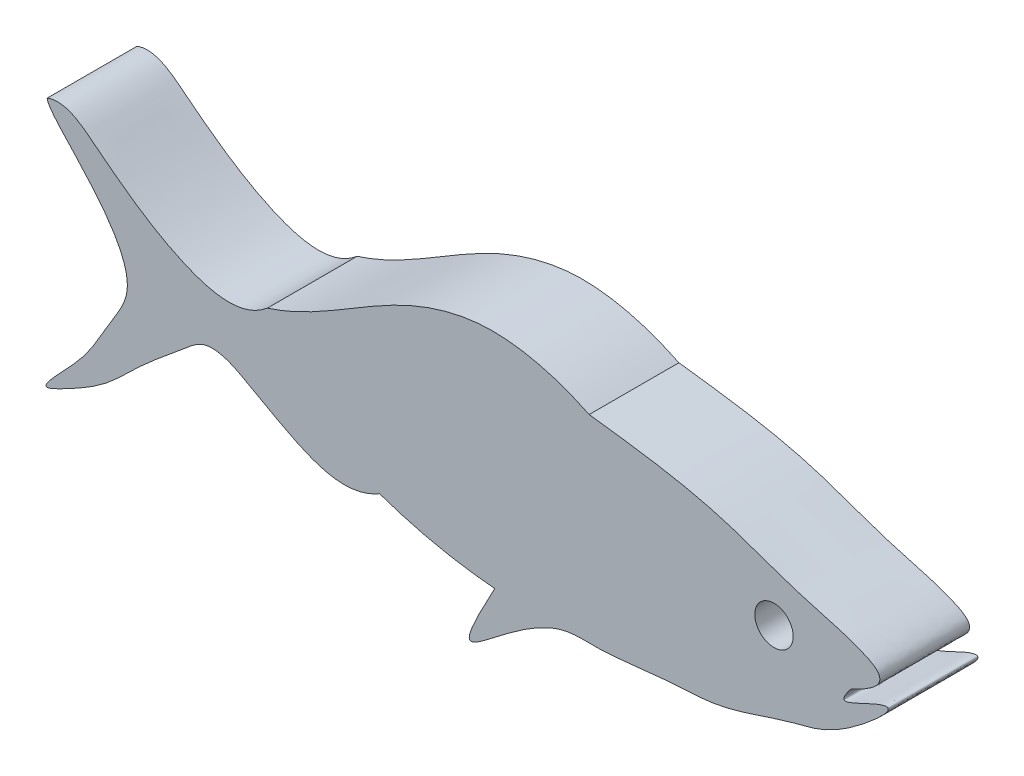
ISO-10303-21;
HEADER;
FILE_DESCRIPTION(('STEP AP214'),'2;1');
FILE_NAME('part.step','',(''),(''),'','','');
FILE_SCHEMA(('AUTOMOTIVE_DESIGN { 1 0 10303 214 1 1 1 1 }'));
ENDSEC;
DATA;
#1=APPLICATION_CONTEXT('core data for automotive mechanical design processes');
#2=APPLICATION_PROTOCOL_DEFINITION('international standard','automotive_design',2000,#1);
#3=PRODUCT_CONTEXT('',#1,'mechanical');
#4=PRODUCT('Part','Part','',(#3));
#5=PRODUCT_RELATED_PRODUCT_CATEGORY('part','',(#4));
#6=PRODUCT_DEFINITION_FORMATION('','',#4);
#7=PRODUCT_DEFINITION_CONTEXT('part definition',#1,'design');
#8=PRODUCT_DEFINITION('design','',#6,#7);
#9=PRODUCT_DEFINITION_SHAPE('','',#8);
#10=(LENGTH_UNIT() NAMED_UNIT(*) SI_UNIT(.MILLI.,.METRE.));
#11=(NAMED_UNIT(*) PLANE_ANGLE_UNIT() SI_UNIT($,.RADIAN.));
#12=(NAMED_UNIT(*) SI_UNIT($,.STERADIAN.) SOLID_ANGLE_UNIT());
#13=UNCERTAINTY_MEASURE_WITH_UNIT(LENGTH_MEASURE(1.E-05),#10,'distance_accuracy_value','');
#14=(GEOMETRIC_REPRESENTATION_CONTEXT(3) GLOBAL_UNCERTAINTY_ASSIGNED_CONTEXT((#13)) GLOBAL_UNIT_ASSIGNED_CONTEXT((#10,
#11,#12)) REPRESENTATION_CONTEXT('',''));
#15=CARTESIAN_POINT('',(0.,0.,0.));
#16=DIRECTION('',(0.,0.,1.));
#17=DIRECTION('',(1.,0.,0.));
#18=AXIS2_PLACEMENT_3D('',#15,#16,#17);
#19=CARTESIAN_POINT('',(-19.9447355971429,4.88440540876296,4.));
#20=CARTESIAN_POINT('',(-19.949825339162,4.18993281900058,4.));
#21=CARTESIAN_POINT('',(-15.1711658704271,0.685726552786548,4.));
#22=CARTESIAN_POINT('',(-17.1777978474402,-2.39926160283761,4.));
#23=CARTESIAN_POINT('',(-18.0514108450529,-4.01748306992373,4.));
#24=CARTESIAN_POINT('',(-18.96242441154,-5.01100343624565,4.));
#25=CARTESIAN_POINT('',(-20.5133079149895,-6.6446088623525,4.));
#26=CARTESIAN_POINT('',(-18.2515229364112,-5.48307361146567,4.));
#27=CARTESIAN_POINT('',(-17.2085296394502,-4.79413839241543,4.));
#28=CARTESIAN_POINT('',(-15.575671892639,-3.13111679952531,4.));
#29=CARTESIAN_POINT('',(-14.2669364889956,-2.10740923352495,4.));
#30=CARTESIAN_POINT('',(-13.036291247088,-1.04042916195259,4.));
#31=CARTESIAN_POINT('',(-11.9782606840176,-1.12322972152947,4.));
#32=CARTESIAN_POINT('',(-10.7856977322172,-1.78259634855396,4.));
#33=CARTESIAN_POINT('',(-8.62423336313745,-3.02116107906366,4.));
#34=CARTESIAN_POINT('',(-6.60026449595006,-3.83670580854514,4.));
#35=CARTESIAN_POINT('',(-5.13415247924559,-2.9801492731696,4.));
#36=B_SPLINE_CURVE_WITH_KNOTS('',3,(#19,#20,#21,#22,#23,#24,#25,#26,#27,#28,#29,#30,#31,#32,#33,
#34,#35),.UNSPECIFIED.,.F.,.F.,(4,1,1,1,1,1,1,1,1,1,1,1,1,1,4),(0.,0.224883954334208,
0.275221164131976,0.346277486905615,0.396651772051358,0.439754498179011,0.475435220106629,
0.557276109546156,0.601534902517405,0.694919715790657,0.728159305927604,0.753251486072146,
0.793093937094394,0.861610277520594,1.),.UNSPECIFIED.);
#37=DIRECTION('',(0.,0.,-1.));
#38=VECTOR('',#37,1.);
#39=SURFACE_OF_LINEAR_EXTRUSION('',#36,#38);
#40=CARTESIAN_POINT('',(-5.13415247924559,-2.9801492731696,3.5));
#41=CARTESIAN_POINT('',(-5.17136092770728,-3.00189511796504,3.50000132208082));
#42=CARTESIAN_POINT('',(-5.20896198937376,-3.02299500940034,3.49861504769969));
#43=CARTESIAN_POINT('',(-5.28475481134917,-3.06375539150977,3.49290455028253));
#44=CARTESIAN_POINT('',(-5.32294703386409,-3.08341467900128,3.48857790176205));
#45=CARTESIAN_POINT('',(-5.39977469664262,-3.12116357662942,3.47680662650953));
#46=CARTESIAN_POINT('',(-5.43841108944632,-3.13924855659057,3.46935315436201));
#47=CARTESIAN_POINT('',(-5.51569002538301,-3.17364069204559,3.45120905699656));
#48=CARTESIAN_POINT('',(-5.55433256395538,-3.18994833167187,3.44051931632292));
#49=CARTESIAN_POINT('',(-5.67018319412835,-3.23620302973106,3.40329888488978));
#50=CARTESIAN_POINT('',(-5.74698284983002,-3.26331961800982,3.37166476810331));
#51=CARTESIAN_POINT('',(-5.89584460321279,-3.30968253749104,3.29492255190584));
#52=CARTESIAN_POINT('',(-5.96791672378368,-3.32894600264244,3.2498441616551));
#53=CARTESIAN_POINT('',(-6.09854059628526,-3.35920117902822,3.15155092614265));
#54=CARTESIAN_POINT('',(-6.15771941639798,-3.37075143247445,3.09933648707278));
#55=CARTESIAN_POINT('',(-6.26749703687245,-3.38920139779472,2.985785286291));
#56=CARTESIAN_POINT('',(-6.31808881455935,-3.39609731683689,2.92444113430641));
#57=CARTESIAN_POINT('',(-6.40935562676399,-3.40662121002775,2.7938816978636));
#58=CARTESIAN_POINT('',(-6.44995745019575,-3.41022555443387,2.7246134549907));
#59=CARTESIAN_POINT('',(-6.51961075611876,-3.41538223060267,2.58044472977475));
#60=CARTESIAN_POINT('',(-6.54866323403983,-3.41693473923844,2.50554473349048));
#61=CARTESIAN_POINT('',(-6.59535135682959,-3.4190423206241,2.34903345132827));
#62=CARTESIAN_POINT('',(-6.61249379198673,-3.41955582434411,2.26727411475127));
#63=CARTESIAN_POINT('',(-6.6329926767681,-3.42013603130265,2.1020363989211));
#64=CARTESIAN_POINT('',(-6.63634710962546,-3.42020266917916,2.01855776998214));
#65=CARTESIAN_POINT('',(-6.62912912331186,-3.42002224021193,1.85119118418015));
#66=CARTESIAN_POINT('',(-6.61838821414484,-3.41977137940049,1.76731043732645));
#67=CARTESIAN_POINT('',(-6.58298863786487,-3.4185132464868,1.60253936828691));
#68=CARTESIAN_POINT('',(-6.55832923767859,-3.41750593454209,1.52164920385125));
#69=CARTESIAN_POINT('',(-6.49582144691173,-3.41376266443228,1.36521846210933));
#70=CARTESIAN_POINT('',(-6.45797972824801,-3.4110275801695,1.28967520182236));
#71=CARTESIAN_POINT('',(-6.37025561270699,-3.40243223323961,1.14611367524664));
#72=CARTESIAN_POINT('',(-6.32037349827219,-3.39657204387703,1.078095232496));
#73=CARTESIAN_POINT('',(-6.21125933924704,-3.38026207308957,0.952806176708751));
#74=CARTESIAN_POINT('',(-6.1522124624749,-3.36989710758872,0.895363614496904));
#75=CARTESIAN_POINT('',(-6.02638759016767,-3.34318807928679,0.791462663656685));
#76=CARTESIAN_POINT('',(-5.95961664047406,-3.32684943668399,0.744994380262436));
#77=CARTESIAN_POINT('',(-5.82393395410617,-3.28811192196446,0.66578926434618));
#78=CARTESIAN_POINT('',(-5.7552278650133,-3.26599443187338,0.632560289274095));
#79=CARTESIAN_POINT('',(-5.61562285998597,-3.21526446893847,0.577387230494791));
#80=CARTESIAN_POINT('',(-5.54472138691677,-3.18664415553956,0.55545687487302));
#81=CARTESIAN_POINT('',(-5.41649331265975,-3.12942328890439,0.525628948587366));
#82=CARTESIAN_POINT('',(-5.35912816078519,-3.10183679302108,0.515864984489601));
#83=CARTESIAN_POINT('',(-5.24559270928452,-3.04335763763095,0.503057300321707));
#84=CARTESIAN_POINT('',(-5.18941884847495,-3.01247725203928,0.499989486962434));
#85=CARTESIAN_POINT('',(-5.13415247924559,-2.9801492731696,0.499999999999919));
#86=B_SPLINE_CURVE_WITH_KNOTS('',3,(#40,#41,#42,#43,#44,#45,#46,#47,#48,#49,#50,#51,#52,#53,#54,
#55,#56,#57,#58,#59,#60,#61,#62,#63,#64,#65,#66,#67,#68,#69,#70,#71,#72,#73,#74,#75,#76,#77,#78,
#79,#80,#81,#82,#83,#84,#85),.UNSPECIFIED.,.F.,.F.,(4,2,2,2,2,2,2,2,2,2,2,2,2,2,2,2,2,2,2,2,2,2,
4),(0.,0.129280788740478,0.25866834952653,0.388424427311073,0.518145071838613,0.778687479102327,
1.03865835264886,1.27681036243428,1.51515620948638,1.7551999562911,1.99522300940918,
2.2446729574565,2.49415939117312,2.7466554199291,2.99916474864555,3.25154646101292,
3.50392225360886,3.75173927150649,3.99933198913571,4.23659144029801,4.47413849136574,
4.6668894437784,4.85894571155556),.UNSPECIFIED.);
#87=CARTESIAN_POINT('',(-5.13415247924559,-2.9801492731696,3.5));
#88=VERTEX_POINT('',#87);
#89=CARTESIAN_POINT('',(-5.13415247924559,-2.9801492731696,0.5));
#90=VERTEX_POINT('',#89);
#91=EDGE_CURVE('E52',#88,#90,#86,.T.);
#92=ORIENTED_EDGE('',*,*,#91,.F.);
#93=DIRECTION('',(0.,0.,-1.));
#94=VECTOR('',#93,1.);
#95=CARTESIAN_POINT('',(-5.13415247924559,-2.9801492731696,4.));
#96=LINE('',#95,#94);
#97=CARTESIAN_POINT('',(-5.13415247924559,-2.9801492731696,4.));
#98=VERTEX_POINT('',#97);
#99=EDGE_CURVE('E126',#98,#88,#96,.T.);
#100=ORIENTED_EDGE('',*,*,#99,.F.);
#101=CARTESIAN_POINT('',(-19.9447355971429,4.88440540876296,4.));
#102=VERTEX_POINT('',#101);
#103=EDGE_CURVE('E109',#102,#98,#36,.T.);
#104=ORIENTED_EDGE('',*,*,#103,.F.);
#105=DIRECTION('',(0.,0.,-1.));
#106=VECTOR('',#105,1.);
#107=CARTESIAN_POINT('',(-19.9447355971429,4.88440540876296,4.));
#108=LINE('',#107,#106);
#109=CARTESIAN_POINT('',(-19.9447355971429,4.88440540876296,0.));
#110=VERTEX_POINT('',#109);
#111=EDGE_CURVE('E118',#102,#110,#108,.T.);
#112=ORIENTED_EDGE('',*,*,#111,.T.);
#113=CARTESIAN_POINT('',(-19.9447355971429,4.88440540876296,0.));
#114=CARTESIAN_POINT('',(-19.949825339162,4.18993281900058,0.));
#115=CARTESIAN_POINT('',(-15.1711658704271,0.685726552786548,0.));
#116=CARTESIAN_POINT('',(-17.1777978474402,-2.39926160283761,0.));
#117=CARTESIAN_POINT('',(-18.0514108450529,-4.01748306992373,0.));
#118=CARTESIAN_POINT('',(-18.96242441154,-5.01100343624565,0.));
#119=CARTESIAN_POINT('',(-20.5133079149895,-6.6446088623525,0.));
#120=CARTESIAN_POINT('',(-18.2515229364112,-5.48307361146567,0.));
#121=CARTESIAN_POINT('',(-17.2085296394502,-4.79413839241543,0.));
#122=CARTESIAN_POINT('',(-15.575671892639,-3.13111679952531,0.));
#123=CARTESIAN_POINT('',(-14.2669364889956,-2.10740923352495,0.));
#124=CARTESIAN_POINT('',(-13.036291247088,-1.04042916195259,0.));
#125=CARTESIAN_POINT('',(-11.9782606840176,-1.12322972152947,0.));
#126=CARTESIAN_POINT('',(-10.7856977322172,-1.78259634855396,0.));
#127=CARTESIAN_POINT('',(-8.62423336313745,-3.02116107906366,0.));
#128=CARTESIAN_POINT('',(-6.60026449595006,-3.83670580854514,0.));
#129=CARTESIAN_POINT('',(-5.13415247924559,-2.9801492731696,0.));
#130=B_SPLINE_CURVE_WITH_KNOTS('',3,(#113,#114,#115,#116,#117,#118,#119,#120,#121,#122,#123,
#124,#125,#126,#127,#128,#129),.UNSPECIFIED.,.F.,.F.,(4,1,1,1,1,1,1,1,1,1,1,1,1,1,4),(0.,
0.224883954334208,0.275221164131976,0.346277486905615,0.396651772051358,0.439754498179011,
0.475435220106629,0.557276109546156,0.601534902517405,0.694919715790657,0.728159305927604,
0.753251486072146,0.793093937094394,0.861610277520594,1.),.UNSPECIFIED.);
#131=CARTESIAN_POINT('',(-5.13415247924559,-2.9801492731696,0.));
#132=VERTEX_POINT('',#131);
#133=EDGE_CURVE('E224',#110,#132,#130,.T.);
#134=ORIENTED_EDGE('',*,*,#133,.T.);
#135=EDGE_CURVE('E248',#90,#132,#96,.T.);
#136=ORIENTED_EDGE('',*,*,#135,.F.);
#137=EDGE_LOOP('',(#92,#100,#104,#112,#134,#136));
#138=FACE_BOUND('',#137,.T.);
#139=ADVANCED_FACE('F33',(#138),#39,.F.);
#140=CARTESIAN_POINT('',(-5.13415247924559,-2.9801492731696,4.));
#141=CARTESIAN_POINT('',(-2.64304114506031,-3.85432225348012,4.));
#142=CARTESIAN_POINT('',(0.,-4.0716833283227,4.));
#143=B_SPLINE_CURVE_WITH_KNOTS('',2,(#140,#141,#142),.UNSPECIFIED.,.F.,.F.,(3,3),(0.,1.),.UNSPECIFIED.);
#144=DIRECTION('',(0.,0.,-1.));
#145=VECTOR('',#144,1.);
#146=SURFACE_OF_LINEAR_EXTRUSION('',#143,#145);
#147=CARTESIAN_POINT('',(-5.13415247924559,-2.9801492731696,0.5));
#148=CARTESIAN_POINT('',(-5.09086220109591,-2.99534139819043,0.500001629211815));
#149=CARTESIAN_POINT('',(-5.04753954165324,-3.01038215500515,0.501875269779768));
#150=CARTESIAN_POINT('',(-4.96108194990491,-3.04008062764418,0.509385113240172));
#151=CARTESIAN_POINT('',(-4.91794705003482,-3.05473827931742,0.51502194213811));
#152=CARTESIAN_POINT('',(-4.78919018607466,-3.09802009940678,0.537610126542299));
#153=CARTESIAN_POINT('',(-4.70425114443944,-3.12594083291073,0.56023920887038));
#154=CARTESIAN_POINT('',(-4.53881927254639,-3.17918832984357,0.620382459333016));
#155=CARTESIAN_POINT('',(-4.45833344875028,-3.20451105633488,0.657919364179468));
#156=CARTESIAN_POINT('',(-4.30460722658291,-3.25192571606806,0.747108883377561));
#157=CARTESIAN_POINT('',(-4.23136033380406,-3.27402055388125,0.798748685840594));
#158=CARTESIAN_POINT('',(-4.09715482828505,-3.31378959576512,0.912752694426656));
#159=CARTESIAN_POINT('',(-4.03584651594475,-3.33159521600712,0.974659244295335));
#160=CARTESIAN_POINT('',(-3.92449572604573,-3.36347069860164,1.10875313730062));
#161=CARTESIAN_POINT('',(-3.87445351577466,-3.37754047232283,1.18094072428796));
#162=CARTESIAN_POINT('',(-3.789417629991,-3.40118881181448,1.33012045706766));
#163=CARTESIAN_POINT('',(-3.75386404814764,-3.41093611776492,1.40676702060718));
#164=CARTESIAN_POINT('',(-3.69605459809716,-3.4266789405403,1.56527451864499));
#165=CARTESIAN_POINT('',(-3.67379522251752,-3.43267544694776,1.64713407150257));
#166=CARTESIAN_POINT('',(-3.64379722231433,-3.44073632088345,1.81129314114629));
#167=CARTESIAN_POINT('',(-3.63567180310747,-3.44290545440264,1.89351704205909));
#168=CARTESIAN_POINT('',(-3.63302175834624,-3.44361412566879,2.05819769216651));
#169=CARTESIAN_POINT('',(-3.63849631912915,-3.44215388055504,2.14065442713626));
#170=CARTESIAN_POINT('',(-3.66273414370596,-3.43565109060255,2.30259451375917));
#171=CARTESIAN_POINT('',(-3.68136353346372,-3.43064463326693,2.38209939692685));
#172=CARTESIAN_POINT('',(-3.73112507694737,-3.41714418742342,2.53676565629168));
#173=CARTESIAN_POINT('',(-3.76225721057074,-3.40865020452294,2.61192703947232));
#174=CARTESIAN_POINT('',(-3.83627829734149,-3.388193552103,2.75640452777542));
#175=CARTESIAN_POINT('',(-3.87924639104269,-3.37620750077496,2.82567702524222));
#176=CARTESIAN_POINT('',(-3.95131174146793,-3.35578709504955,2.92332630801045));
#177=CARTESIAN_POINT('',(-3.97660911347083,-3.3485714570205,2.95483937738466));
#178=CARTESIAN_POINT('',(-4.02957580452749,-3.33334282019316,3.01564607618023));
#179=CARTESIAN_POINT('',(-4.05724705230491,-3.3253291721624,3.04493786375317));
#180=CARTESIAN_POINT('',(-4.14478908685917,-3.29975984164256,3.13044385518982));
#181=CARTESIAN_POINT('',(-4.20811235528487,-3.28097774850708,3.18283360332709));
#182=CARTESIAN_POINT('',(-4.34181477961069,-3.24052966682383,3.27626738254756));
#183=CARTESIAN_POINT('',(-4.4121960331263,-3.21886282030395,3.31730802700735));
#184=CARTESIAN_POINT('',(-4.52292525052694,-3.18407083555373,3.37046387913845));
#185=CARTESIAN_POINT('',(-4.56148199241758,-3.17183489689174,3.38700994180192));
#186=CARTESIAN_POINT('',(-4.63963216229552,-3.14677360196141,3.41675605897296));
#187=CARTESIAN_POINT('',(-4.67922469315472,-3.13394874894253,3.42995890975966));
#188=CARTESIAN_POINT('',(-4.79916415921596,-3.09468422668704,3.4644739022936));
#189=CARTESIAN_POINT('',(-4.88078132595273,-3.06742066440634,3.48074411743749));
#190=CARTESIAN_POINT('',(-4.99132291976539,-3.02971146038382,3.49346229218986));
#191=CARTESIAN_POINT('',(-5.01989807400433,-3.01989357548038,3.49591759094367));
#192=CARTESIAN_POINT('',(-5.07703545377781,-3.00012245219842,3.49918371742288));
#193=CARTESIAN_POINT('',(-5.10559760298572,-2.99016950232174,3.49999762178063));
#194=CARTESIAN_POINT('',(-5.13415247924559,-2.9801492731696,3.5));
#195=B_SPLINE_CURVE_WITH_KNOTS('',3,(#147,#148,#149,#150,#151,#152,#153,#154,#155,#156,#157,
#158,#159,#160,#161,#162,#163,#164,#165,#166,#167,#168,#169,#170,#171,#172,#173,#174,#175,#176,
#177,#178,#179,#180,#181,#182,#183,#184,#185,#186,#187,#188,#189,#190,#191,#192,#193,#194),
.UNSPECIFIED.,.F.,.F.,(4,2,2,2,2,2,2,2,2,2,2,2,2,2,2,2,2,2,2,2,2,2,2,4),(0.,0.13755698252647,
0.275136853328013,0.550406762392846,0.826098122456524,1.10153985689982,1.36697705928115,
1.63242055848232,1.88631757717355,2.14014758131426,2.38691498386884,2.63366762312244,
2.87794464096322,3.1222212660451,3.36817263349071,3.49120514079391,3.61433857366321,
3.8660423128276,4.11782108066477,4.24880402285701,4.37967704567412,4.64105300707434,
4.73196732235504,4.82271106871367),.UNSPECIFIED.);
#196=EDGE_CURVE('E11',#90,#88,#195,.T.);
#197=ORIENTED_EDGE('',*,*,#196,.F.);
#198=ORIENTED_EDGE('',*,*,#135,.T.);
#199=CARTESIAN_POINT('',(-5.13415247924559,-2.9801492731696,0.));
#200=CARTESIAN_POINT('',(-2.64304114506031,-3.85432225348012,0.));
#201=CARTESIAN_POINT('',(0.,-4.0716833283227,0.));
#202=B_SPLINE_CURVE_WITH_KNOTS('',2,(#199,#200,#201),.UNSPECIFIED.,.F.,.F.,(3,3),(0.,1.),.UNSPECIFIED.);
#203=CARTESIAN_POINT('',(0.,-4.0716833283227,0.));
#204=VERTEX_POINT('',#203);
#205=EDGE_CURVE('E87',#132,#204,#202,.T.);
#206=ORIENTED_EDGE('',*,*,#205,.T.);
#207=DIRECTION('',(0.,0.,-1.));
#208=VECTOR('',#207,1.);
#209=CARTESIAN_POINT('',(0.,-4.0716833283227,4.));
#210=LINE('',#209,#208);
#211=CARTESIAN_POINT('',(0.,-4.0716833283227,4.));
#212=VERTEX_POINT('',#211);
#213=EDGE_CURVE('E130',#212,#204,#210,.T.);
#214=ORIENTED_EDGE('',*,*,#213,.F.);
#215=EDGE_CURVE('E61',#98,#212,#143,.T.);
#216=ORIENTED_EDGE('',*,*,#215,.F.);
#217=ORIENTED_EDGE('',*,*,#99,.T.);
#218=EDGE_LOOP('',(#197,#198,#206,#214,#216,#217));
#219=FACE_BOUND('',#218,.T.);
#220=ADVANCED_FACE('F150',(#219),#146,.F.);
#221=CARTESIAN_POINT('',(8.26791885972183,-3.75480258167954,4.));
#222=DIRECTION('',(0.,0.,-1.));
#223=DIRECTION('',(-1.,0.,0.));
#224=AXIS2_PLACEMENT_3D('',#221,#222,#223);
#225=PLANE('',#224);
#226=CARTESIAN_POINT('',(0.,-4.0716833283227,4.));
#227=CARTESIAN_POINT('',(-2.94907026192547,-9.48901281345573,4.));
#228=CARTESIAN_POINT('',(1.10289628649472,-3.86712024899,4.));
#229=CARTESIAN_POINT('',(5.06943536775455,-4.14914579117185,4.));
#230=CARTESIAN_POINT('',(7.3448411406037,-3.74197065139133,4.));
#231=CARTESIAN_POINT('',(10.2578954273383,-3.72737004811426,4.));
#232=CARTESIAN_POINT('',(13.0868941774645,-2.52788309007423,4.));
#233=CARTESIAN_POINT('',(15.1654929019802,-2.29150120013536,4.));
#234=CARTESIAN_POINT('',(18.1568385292368,0.344794309837319,4.));
#235=CARTESIAN_POINT('',(16.4165968194944,-0.200758471620055,4.));
#236=CARTESIAN_POINT('',(14.94919339711,-1.18142842010309,4.));
#237=CARTESIAN_POINT('',(15.8867049386605,0.,4.));
#238=B_SPLINE_CURVE_WITH_KNOTS('',3,(#226,#227,#228,#229,#230,#231,#232,#233,#234,#235,#236,
#237),.UNSPECIFIED.,.F.,.F.,(4,1,1,1,1,1,1,1,1,4),(0.,0.29636586985751,0.351295346616032,
0.47737460327174,0.561694797005015,0.696649302290089,0.802297749581979,0.898253063295431,
0.91081662158865,1.),.UNSPECIFIED.);
#239=CARTESIAN_POINT('',(15.8867049386605,0.,4.));
#240=VERTEX_POINT('',#239);
#241=EDGE_CURVE('E193',#212,#240,#238,.T.);
#242=ORIENTED_EDGE('',*,*,#241,.T.);
#243=CARTESIAN_POINT('',(15.8867049386605,0.,4.));
#244=CARTESIAN_POINT('',(17.9045710569473,0.901587329354894,4.));
#245=CARTESIAN_POINT('',(16.2577118600268,1.86013881206874,4.));
#246=CARTESIAN_POINT('',(13.4421667371994,2.46506665199857,4.));
#247=CARTESIAN_POINT('',(9.51806641328556,4.09016268730713,4.));
#248=CARTESIAN_POINT('',(6.19759723432263,4.49257901751975,4.));
#249=CARTESIAN_POINT('',(4.20679652747311,4.74645533403896,4.));
#250=B_SPLINE_CURVE_WITH_KNOTS('',3,(#243,#244,#245,#246,#247,#248,#249),.UNSPECIFIED.,.F.,.F.,
(4,1,1,1,4),(0.,0.160361296026586,0.331409231541839,0.596131316989325,1.),.UNSPECIFIED.);
#251=CARTESIAN_POINT('',(4.20679652747311,4.74645533403896,4.));
#252=VERTEX_POINT('',#251);
#253=EDGE_CURVE('E96',#240,#252,#250,.T.);
#254=ORIENTED_EDGE('',*,*,#253,.T.);
#255=CARTESIAN_POINT('',(4.20679652747311,4.74645533403896,4.));
#256=CARTESIAN_POINT('',(2.79623214224876,5.42702926604071,4.));
#257=CARTESIAN_POINT('',(0.0229154113773798,6.21216305565841,4.));
#258=CARTESIAN_POINT('',(-5.05941025061707,4.76587674382752,4.));
#259=CARTESIAN_POINT('',(-7.82184861806957,2.4147486469162,4.));
#260=CARTESIAN_POINT('',(-10.1331128731523,1.68353714699928,4.));
#261=B_SPLINE_CURVE_WITH_KNOTS('',3,(#255,#256,#257,#258,#259,#260),.UNSPECIFIED.,.F.,.F.,(4,1,
1,4),(0.,0.308644845232013,0.533362816315557,1.),.UNSPECIFIED.);
#262=CARTESIAN_POINT('',(-10.1331128731523,1.68353714699928,4.));
#263=VERTEX_POINT('',#262);
#264=EDGE_CURVE('E112',#252,#263,#261,.T.);
#265=ORIENTED_EDGE('',*,*,#264,.T.);
#266=CARTESIAN_POINT('',(-10.1331128731523,1.68353714699928,4.));
#267=CARTESIAN_POINT('',(-11.2569078004882,0.734625305928196,4.));
#268=CARTESIAN_POINT('',(-13.4503323280236,1.20427599494875,4.));
#269=CARTESIAN_POINT('',(-15.8934366102215,2.65451304055486,4.));
#270=CARTESIAN_POINT('',(-17.7300083541156,4.03766375986439,4.));
#271=CARTESIAN_POINT('',(-19.1075443276582,5.20776801501206,4.));
#272=CARTESIAN_POINT('',(-19.944735597143,4.88440540876296,4.));
#273=B_SPLINE_CURVE_WITH_KNOTS('',3,(#266,#267,#268,#269,#270,#271,#272),.UNSPECIFIED.,.F.,.F.,
(4,1,1,1,4),(0.,0.347298706671921,0.573357467443896,0.771983967387547,1.),.UNSPECIFIED.);
#274=EDGE_CURVE('E104',#263,#102,#273,.T.);
#275=ORIENTED_EDGE('',*,*,#274,.T.);
#276=ORIENTED_EDGE('',*,*,#103,.T.);
#277=ORIENTED_EDGE('',*,*,#215,.T.);
#278=EDGE_LOOP('',(#242,#254,#265,#275,#276,#277));
#279=FACE_BOUND('',#278,.T.);
#280=CARTESIAN_POINT('',(12.4428319641767,0.727358699401964,4.));
#281=DIRECTION('',(0.,0.,1.));
#282=DIRECTION('',(1.,0.,0.));
#283=AXIS2_PLACEMENT_3D('',#280,#281,#282);
#284=CIRCLE('',#283,0.856198578102016);
#285=CARTESIAN_POINT('',(13.2990305422787,0.727358699401964,4.));
#286=VERTEX_POINT('',#285);
#287=EDGE_CURVE('E162',#286,#286,#284,.T.);
#288=ORIENTED_EDGE('',*,*,#287,.F.);
#289=EDGE_LOOP('',(#288));
#290=FACE_BOUND('',#289,.T.);
#291=ADVANCED_FACE('F106',(#279,#290),#225,.F.);
#292=CARTESIAN_POINT('',(8.26791885972183,-3.75480258167954,0.));
#293=DIRECTION('',(0.,0.,-1.));
#294=DIRECTION('',(-1.,0.,0.));
#295=AXIS2_PLACEMENT_3D('',#292,#293,#294);
#296=PLANE('',#295);
#297=CARTESIAN_POINT('',(0.,-4.0716833283227,0.));
#298=CARTESIAN_POINT('',(-2.94907026192547,-9.48901281345573,0.));
#299=CARTESIAN_POINT('',(1.10289628649472,-3.86712024899,0.));
#300=CARTESIAN_POINT('',(5.06943536775455,-4.14914579117185,0.));
#301=CARTESIAN_POINT('',(7.3448411406037,-3.74197065139133,0.));
#302=CARTESIAN_POINT('',(10.2578954273383,-3.72737004811426,0.));
#303=CARTESIAN_POINT('',(13.0868941774645,-2.52788309007423,0.));
#304=CARTESIAN_POINT('',(15.1654929019802,-2.29150120013536,0.));
#305=CARTESIAN_POINT('',(18.1568385292368,0.344794309837319,0.));
#306=CARTESIAN_POINT('',(16.4165968194944,-0.200758471620055,0.));
#307=CARTESIAN_POINT('',(14.94919339711,-1.18142842010309,0.));
#308=CARTESIAN_POINT('',(15.8867049386605,0.,0.));
#309=B_SPLINE_CURVE_WITH_KNOTS('',3,(#297,#298,#299,#300,#301,#302,#303,#304,#305,#306,#307,
#308),.UNSPECIFIED.,.F.,.F.,(4,1,1,1,1,1,1,1,1,4),(0.,0.29636586985751,0.351295346616032,
0.47737460327174,0.561694797005015,0.696649302290089,0.802297749581979,0.898253063295431,
0.91081662158865,1.),.UNSPECIFIED.);
#310=CARTESIAN_POINT('',(15.8867049386605,0.,0.));
#311=VERTEX_POINT('',#310);
#312=EDGE_CURVE('E188',#204,#311,#309,.T.);
#313=ORIENTED_EDGE('',*,*,#312,.F.);
#314=ORIENTED_EDGE('',*,*,#205,.F.);
#315=ORIENTED_EDGE('',*,*,#133,.F.);
#316=CARTESIAN_POINT('',(-10.1331128731523,1.68353714699928,0.));
#317=CARTESIAN_POINT('',(-11.2569078004882,0.734625305928196,0.));
#318=CARTESIAN_POINT('',(-13.4503323280236,1.20427599494875,0.));
#319=CARTESIAN_POINT('',(-15.8934366102215,2.65451304055486,0.));
#320=CARTESIAN_POINT('',(-17.7300083541156,4.03766375986439,0.));
#321=CARTESIAN_POINT('',(-19.1075443276582,5.20776801501206,0.));
#322=CARTESIAN_POINT('',(-19.944735597143,4.88440540876296,0.));
#323=B_SPLINE_CURVE_WITH_KNOTS('',3,(#316,#317,#318,#319,#320,#321,#322),.UNSPECIFIED.,.F.,.F.,
(4,1,1,1,4),(0.,0.347298706671921,0.573357467443896,0.771983967387547,1.),.UNSPECIFIED.);
#324=CARTESIAN_POINT('',(-10.1331128731523,1.68353714699928,0.));
#325=VERTEX_POINT('',#324);
#326=EDGE_CURVE('E121',#325,#110,#323,.T.);
#327=ORIENTED_EDGE('',*,*,#326,.F.);
#328=CARTESIAN_POINT('',(4.20679652747311,4.74645533403896,0.));
#329=CARTESIAN_POINT('',(2.79623214224876,5.42702926604071,0.));
#330=CARTESIAN_POINT('',(0.0229154113773798,6.21216305565841,0.));
#331=CARTESIAN_POINT('',(-5.05941025061707,4.76587674382752,0.));
#332=CARTESIAN_POINT('',(-7.82184861806957,2.4147486469162,0.));
#333=CARTESIAN_POINT('',(-10.1331128731523,1.68353714699928,0.));
#334=B_SPLINE_CURVE_WITH_KNOTS('',3,(#328,#329,#330,#331,#332,#333),.UNSPECIFIED.,.F.,.F.,(4,1,
1,4),(0.,0.308644845232013,0.533362816315557,1.),.UNSPECIFIED.);
#335=CARTESIAN_POINT('',(4.20679652747311,4.74645533403896,0.));
#336=VERTEX_POINT('',#335);
#337=EDGE_CURVE('E219',#336,#325,#334,.T.);
#338=ORIENTED_EDGE('',*,*,#337,.F.);
#339=CARTESIAN_POINT('',(15.8867049386605,0.,0.));
#340=CARTESIAN_POINT('',(17.9045710569473,0.901587329354894,0.));
#341=CARTESIAN_POINT('',(16.2577118600268,1.86013881206874,0.));
#342=CARTESIAN_POINT('',(13.4421667371994,2.46506665199857,0.));
#343=CARTESIAN_POINT('',(9.51806641328556,4.09016268730713,0.));
#344=CARTESIAN_POINT('',(6.19759723432263,4.49257901751975,0.));
#345=CARTESIAN_POINT('',(4.20679652747311,4.74645533403896,0.));
#346=B_SPLINE_CURVE_WITH_KNOTS('',3,(#339,#340,#341,#342,#343,#344,#345),.UNSPECIFIED.,.F.,.F.,
(4,1,1,1,4),(0.,0.160361296026586,0.331409231541839,0.596131316989325,1.),.UNSPECIFIED.);
#347=EDGE_CURVE('E221',#311,#336,#346,.T.);
#348=ORIENTED_EDGE('',*,*,#347,.F.);
#349=EDGE_LOOP('',(#313,#314,#315,#327,#338,#348));
#350=FACE_BOUND('',#349,.T.);
#351=CARTESIAN_POINT('',(12.4428319641767,0.727358699401964,0.));
#352=DIRECTION('',(0.,0.,1.));
#353=DIRECTION('',(1.,0.,0.));
#354=AXIS2_PLACEMENT_3D('',#351,#352,#353);
#355=CIRCLE('',#354,0.856198578102016);
#356=CARTESIAN_POINT('',(13.2990305422787,0.727358699401964,0.));
#357=VERTEX_POINT('',#356);
#358=EDGE_CURVE('E160',#357,#357,#355,.T.);
#359=ORIENTED_EDGE('',*,*,#358,.T.);
#360=EDGE_LOOP('',(#359));
#361=FACE_BOUND('',#360,.T.);
#362=ADVANCED_FACE('F177',(#350,#361),#296,.T.);
#363=DIRECTION('',(0.,0.,-1.));
#364=VECTOR('',#363,1.);
#365=SURFACE_OF_LINEAR_EXTRUSION('',#238,#364);
#366=ORIENTED_EDGE('',*,*,#312,.T.);
#367=DIRECTION('',(0.,0.,-1.));
#368=VECTOR('',#367,1.);
#369=CARTESIAN_POINT('',(15.8867049386605,0.,4.));
#370=LINE('',#369,#368);
#371=EDGE_CURVE('E47',#240,#311,#370,.T.);
#372=ORIENTED_EDGE('',*,*,#371,.F.);
#373=ORIENTED_EDGE('',*,*,#241,.F.);
#374=ORIENTED_EDGE('',*,*,#213,.T.);
#375=EDGE_LOOP('',(#366,#372,#373,#374));
#376=FACE_BOUND('',#375,.T.);
#377=ADVANCED_FACE('F35',(#376),#365,.F.);
#378=DIRECTION('',(0.,0.,-1.));
#379=VECTOR('',#378,1.);
#380=SURFACE_OF_LINEAR_EXTRUSION('',#250,#379);
#381=ORIENTED_EDGE('',*,*,#347,.T.);
#382=DIRECTION('',(0.,0.,-1.));
#383=VECTOR('',#382,1.);
#384=CARTESIAN_POINT('',(4.20679652747311,4.74645533403896,4.));
#385=LINE('',#384,#383);
#386=EDGE_CURVE('E220',#252,#336,#385,.T.);
#387=ORIENTED_EDGE('',*,*,#386,.F.);
#388=ORIENTED_EDGE('',*,*,#253,.F.);
#389=ORIENTED_EDGE('',*,*,#371,.T.);
#390=EDGE_LOOP('',(#381,#387,#388,#389));
#391=FACE_BOUND('',#390,.T.);
#392=ADVANCED_FACE('F183',(#391),#380,.F.);
#393=DIRECTION('',(0.,0.,-1.));
#394=VECTOR('',#393,1.);
#395=SURFACE_OF_LINEAR_EXTRUSION('',#261,#394);
#396=ORIENTED_EDGE('',*,*,#337,.T.);
#397=DIRECTION('',(0.,0.,-1.));
#398=VECTOR('',#397,1.);
#399=CARTESIAN_POINT('',(-10.1331128731523,1.68353714699928,4.));
#400=LINE('',#399,#398);
#401=EDGE_CURVE('E125',#263,#325,#400,.T.);
#402=ORIENTED_EDGE('',*,*,#401,.F.);
#403=ORIENTED_EDGE('',*,*,#264,.F.);
#404=ORIENTED_EDGE('',*,*,#386,.T.);
#405=EDGE_LOOP('',(#396,#402,#403,#404));
#406=FACE_BOUND('',#405,.T.);
#407=ADVANCED_FACE('F211',(#406),#395,.F.);
#408=DIRECTION('',(0.,0.,-1.));
#409=VECTOR('',#408,1.);
#410=SURFACE_OF_LINEAR_EXTRUSION('',#273,#409);
#411=ORIENTED_EDGE('',*,*,#326,.T.);
#412=ORIENTED_EDGE('',*,*,#111,.F.);
#413=ORIENTED_EDGE('',*,*,#274,.F.);
#414=ORIENTED_EDGE('',*,*,#401,.T.);
#415=EDGE_LOOP('',(#411,#412,#413,#414));
#416=FACE_BOUND('',#415,.T.);
#417=ADVANCED_FACE('F119',(#416),#410,.F.);
#418=CARTESIAN_POINT('',(12.4428319641767,0.727358699401964,4.));
#419=DIRECTION('',(0.,0.,-1.));
#420=DIRECTION('',(-1.,0.,0.));
#421=AXIS2_PLACEMENT_3D('',#418,#419,#420);
#422=CYLINDRICAL_SURFACE('',#421,0.856198578102016);
#423=ORIENTED_EDGE('',*,*,#287,.T.);
#424=EDGE_LOOP('',(#423));
#425=FACE_BOUND('',#424,.T.);
#426=ORIENTED_EDGE('',*,*,#358,.F.);
#427=EDGE_LOOP('',(#426));
#428=FACE_BOUND('',#427,.T.);
#429=ADVANCED_FACE('F170',(#425,#428),#422,.F.);
#430=CARTESIAN_POINT('',(-5.13415247924559,-0.999999999999999,2.));
#431=DIRECTION('',(0.,-1.,0.));
#432=DIRECTION('',(0.,0.,-1.));
#433=AXIS2_PLACEMENT_3D('',#430,#431,#432);
#434=CYLINDRICAL_SURFACE('',#433,1.5);
#435=CARTESIAN_POINT('',(-5.13415247924559,-0.999999999999999,2.));
#436=DIRECTION('',(0.,1.,0.));
#437=DIRECTION('',(0.,0.,1.));
#438=AXIS2_PLACEMENT_3D('',#435,#436,#437);
#439=CIRCLE('',#438,1.5);
#440=CARTESIAN_POINT('',(-5.13415247924559,-0.999999999999999,3.5));
#441=VERTEX_POINT('',#440);
#442=EDGE_CURVE('E161',#441,#441,#439,.T.);
#443=ORIENTED_EDGE('',*,*,#442,.T.);
#444=EDGE_LOOP('',(#443));
#445=FACE_BOUND('',#444,.T.);
#446=ORIENTED_EDGE('',*,*,#91,.T.);
#447=ORIENTED_EDGE('',*,*,#196,.T.);
#448=EDGE_LOOP('',(#446,#447));
#449=FACE_BOUND('',#448,.T.);
#450=ADVANCED_FACE('F164',(#445,#449),#434,.F.);
#451=CARTESIAN_POINT('',(-5.13415247924559,-0.999999999999999,2.));
#452=DIRECTION('',(0.,1.,0.));
#453=DIRECTION('',(0.,0.,1.));
#454=AXIS2_PLACEMENT_3D('',#451,#452,#453);
#455=PLANE('',#454);
#456=ORIENTED_EDGE('',*,*,#442,.F.);
#457=EDGE_LOOP('',(#456));
#458=FACE_BOUND('',#457,.T.);
#459=ADVANCED_FACE('F169',(#458),#455,.F.);
#460=CLOSED_SHELL('',(#139,#220,#291,#362,#377,#392,#407,#417,#429,#450,#459));
#461=MANIFOLD_SOLID_BREP('B2',#460);
#462=ADVANCED_BREP_SHAPE_REPRESENTATION('',(#18,#461),#14);
#463=SHAPE_DEFINITION_REPRESENTATION(#9,#462);
ENDSEC;
END-ISO-10303-21;
